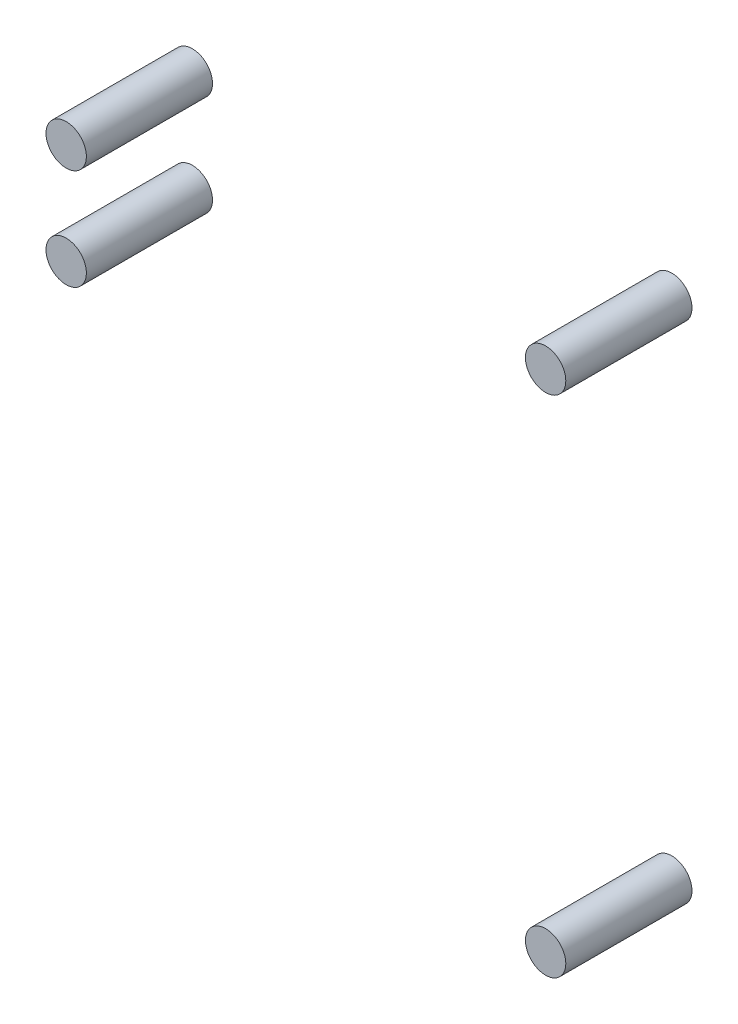
ISO-10303-21;
HEADER;
FILE_DESCRIPTION(('STEP AP214'),'2;1');
FILE_NAME('part.step','',(''),(''),'','','');
FILE_SCHEMA(('AUTOMOTIVE_DESIGN { 1 0 10303 214 1 1 1 1 }'));
ENDSEC;
DATA;
#1=APPLICATION_CONTEXT('core data for automotive mechanical design processes');
#2=APPLICATION_PROTOCOL_DEFINITION('international standard','automotive_design',2000,#1);
#3=PRODUCT_CONTEXT('',#1,'mechanical');
#4=PRODUCT('Part','Part','',(#3));
#5=PRODUCT_RELATED_PRODUCT_CATEGORY('part','',(#4));
#6=PRODUCT_DEFINITION_FORMATION('','',#4);
#7=PRODUCT_DEFINITION_CONTEXT('part definition',#1,'design');
#8=PRODUCT_DEFINITION('design','',#6,#7);
#9=PRODUCT_DEFINITION_SHAPE('','',#8);
#10=(LENGTH_UNIT() NAMED_UNIT(*) SI_UNIT(.MILLI.,.METRE.));
#11=(NAMED_UNIT(*) PLANE_ANGLE_UNIT() SI_UNIT($,.RADIAN.));
#12=(NAMED_UNIT(*) SI_UNIT($,.STERADIAN.) SOLID_ANGLE_UNIT());
#13=UNCERTAINTY_MEASURE_WITH_UNIT(LENGTH_MEASURE(1.E-05),#10,'distance_accuracy_value','');
#14=(GEOMETRIC_REPRESENTATION_CONTEXT(3) GLOBAL_UNCERTAINTY_ASSIGNED_CONTEXT((#13)) GLOBAL_UNIT_ASSIGNED_CONTEXT((#10,
#11,#12)) REPRESENTATION_CONTEXT('',''));
#15=CARTESIAN_POINT('',(0.,0.,0.));
#16=DIRECTION('',(0.,0.,1.));
#17=DIRECTION('',(1.,0.,0.));
#18=AXIS2_PLACEMENT_3D('',#15,#16,#17);
#19=CARTESIAN_POINT('',(74.5,-27.,5.));
#20=DIRECTION('',(0.,0.,-1.));
#21=DIRECTION('',(-1.,0.,0.));
#22=AXIS2_PLACEMENT_3D('',#19,#20,#21);
#23=CYLINDRICAL_SURFACE('',#22,2.);
#24=CARTESIAN_POINT('',(74.5,-27.,5.));
#25=DIRECTION('',(0.,0.,1.));
#26=DIRECTION('',(1.,0.,0.));
#27=AXIS2_PLACEMENT_3D('',#24,#25,#26);
#28=CIRCLE('',#27,2.);
#29=CARTESIAN_POINT('',(76.5,-27.,5.));
#30=VERTEX_POINT('',#29);
#31=EDGE_CURVE('E51',#30,#30,#28,.T.);
#32=ORIENTED_EDGE('',*,*,#31,.F.);
#33=EDGE_LOOP('',(#32));
#34=FACE_BOUND('',#33,.T.);
#35=CARTESIAN_POINT('',(74.5,-27.,-7.5));
#36=DIRECTION('',(0.,0.,1.));
#37=DIRECTION('',(1.,0.,0.));
#38=AXIS2_PLACEMENT_3D('',#35,#36,#37);
#39=CIRCLE('',#38,2.);
#40=CARTESIAN_POINT('',(76.5,-27.,-7.5));
#41=VERTEX_POINT('',#40);
#42=EDGE_CURVE('E11',#41,#41,#39,.T.);
#43=ORIENTED_EDGE('',*,*,#42,.T.);
#44=EDGE_LOOP('',(#43));
#45=FACE_BOUND('',#44,.T.);
#46=ADVANCED_FACE('F44',(#34,#45),#23,.T.);
#47=CARTESIAN_POINT('',(74.5,-27.,5.));
#48=DIRECTION('',(0.,0.,1.));
#49=DIRECTION('',(1.,0.,0.));
#50=AXIS2_PLACEMENT_3D('',#47,#48,#49);
#51=PLANE('',#50);
#52=ORIENTED_EDGE('',*,*,#31,.T.);
#53=EDGE_LOOP('',(#52));
#54=FACE_BOUND('',#53,.T.);
#55=ADVANCED_FACE('F57',(#54),#51,.T.);
#56=CARTESIAN_POINT('',(74.5,-27.,-7.5));
#57=DIRECTION('',(0.,0.,1.));
#58=DIRECTION('',(1.,0.,0.));
#59=AXIS2_PLACEMENT_3D('',#56,#57,#58);
#60=PLANE('',#59);
#61=ORIENTED_EDGE('',*,*,#42,.F.);
#62=EDGE_LOOP('',(#61));
#63=FACE_BOUND('',#62,.T.);
#64=ADVANCED_FACE('F46',(#63),#60,.F.);
#65=CLOSED_SHELL('',(#46,#55,#64));
#66=MANIFOLD_SOLID_BREP('B2',#65);
#67=CARTESIAN_POINT('',(74.5,23.,5.));
#68=DIRECTION('',(0.,0.,-1.));
#69=DIRECTION('',(-1.,0.,0.));
#70=AXIS2_PLACEMENT_3D('',#67,#68,#69);
#71=CYLINDRICAL_SURFACE('',#70,2.);
#72=CARTESIAN_POINT('',(74.5,23.,5.));
#73=DIRECTION('',(0.,0.,1.));
#74=DIRECTION('',(1.,0.,0.));
#75=AXIS2_PLACEMENT_3D('',#72,#73,#74);
#76=CIRCLE('',#75,2.);
#77=CARTESIAN_POINT('',(76.5,23.,5.));
#78=VERTEX_POINT('',#77);
#79=EDGE_CURVE('E106',#78,#78,#76,.T.);
#80=ORIENTED_EDGE('',*,*,#79,.F.);
#81=EDGE_LOOP('',(#80));
#82=FACE_BOUND('',#81,.T.);
#83=CARTESIAN_POINT('',(74.5,23.,-7.5));
#84=DIRECTION('',(0.,0.,1.));
#85=DIRECTION('',(1.,0.,0.));
#86=AXIS2_PLACEMENT_3D('',#83,#84,#85);
#87=CIRCLE('',#86,2.);
#88=CARTESIAN_POINT('',(76.5,23.,-7.5));
#89=VERTEX_POINT('',#88);
#90=EDGE_CURVE('E43',#89,#89,#87,.T.);
#91=ORIENTED_EDGE('',*,*,#90,.T.);
#92=EDGE_LOOP('',(#91));
#93=FACE_BOUND('',#92,.T.);
#94=ADVANCED_FACE('F99',(#82,#93),#71,.T.);
#95=CARTESIAN_POINT('',(74.5,23.,5.));
#96=DIRECTION('',(0.,0.,1.));
#97=DIRECTION('',(1.,0.,0.));
#98=AXIS2_PLACEMENT_3D('',#95,#96,#97);
#99=PLANE('',#98);
#100=ORIENTED_EDGE('',*,*,#79,.T.);
#101=EDGE_LOOP('',(#100));
#102=FACE_BOUND('',#101,.T.);
#103=ADVANCED_FACE('F112',(#102),#99,.T.);
#104=CARTESIAN_POINT('',(74.5,23.,-7.5));
#105=DIRECTION('',(0.,0.,1.));
#106=DIRECTION('',(1.,0.,0.));
#107=AXIS2_PLACEMENT_3D('',#104,#105,#106);
#108=PLANE('',#107);
#109=ORIENTED_EDGE('',*,*,#90,.F.);
#110=EDGE_LOOP('',(#109));
#111=FACE_BOUND('',#110,.T.);
#112=ADVANCED_FACE('F101',(#111),#108,.F.);
#113=CLOSED_SHELL('',(#94,#103,#112));
#114=MANIFOLD_SOLID_BREP('B6',#113);
#115=CARTESIAN_POINT('',(27.,18.5,5.));
#116=DIRECTION('',(0.,0.,-1.));
#117=DIRECTION('',(-1.,0.,0.));
#118=AXIS2_PLACEMENT_3D('',#115,#116,#117);
#119=CYLINDRICAL_SURFACE('',#118,2.00000000000001);
#120=CARTESIAN_POINT('',(27.,18.5,5.));
#121=DIRECTION('',(0.,0.,1.));
#122=DIRECTION('',(1.,0.,0.));
#123=AXIS2_PLACEMENT_3D('',#120,#121,#122);
#124=CIRCLE('',#123,2.00000000000001);
#125=CARTESIAN_POINT('',(29.,18.5,5.));
#126=VERTEX_POINT('',#125);
#127=EDGE_CURVE('E160',#126,#126,#124,.T.);
#128=ORIENTED_EDGE('',*,*,#127,.F.);
#129=EDGE_LOOP('',(#128));
#130=FACE_BOUND('',#129,.T.);
#131=CARTESIAN_POINT('',(27.,18.5,-7.5));
#132=DIRECTION('',(0.,0.,1.));
#133=DIRECTION('',(1.,0.,0.));
#134=AXIS2_PLACEMENT_3D('',#131,#132,#133);
#135=CIRCLE('',#134,2.00000000000001);
#136=CARTESIAN_POINT('',(29.,18.5,-7.5));
#137=VERTEX_POINT('',#136);
#138=EDGE_CURVE('E98',#137,#137,#135,.T.);
#139=ORIENTED_EDGE('',*,*,#138,.T.);
#140=EDGE_LOOP('',(#139));
#141=FACE_BOUND('',#140,.T.);
#142=ADVANCED_FACE('F153',(#130,#141),#119,.T.);
#143=CARTESIAN_POINT('',(27.,18.5,5.));
#144=DIRECTION('',(0.,0.,1.));
#145=DIRECTION('',(1.,0.,0.));
#146=AXIS2_PLACEMENT_3D('',#143,#144,#145);
#147=PLANE('',#146);
#148=ORIENTED_EDGE('',*,*,#127,.T.);
#149=EDGE_LOOP('',(#148));
#150=FACE_BOUND('',#149,.T.);
#151=ADVANCED_FACE('F166',(#150),#147,.T.);
#152=CARTESIAN_POINT('',(27.,18.5,-7.5));
#153=DIRECTION('',(0.,0.,1.));
#154=DIRECTION('',(1.,0.,0.));
#155=AXIS2_PLACEMENT_3D('',#152,#153,#154);
#156=PLANE('',#155);
#157=ORIENTED_EDGE('',*,*,#138,.F.);
#158=EDGE_LOOP('',(#157));
#159=FACE_BOUND('',#158,.T.);
#160=ADVANCED_FACE('F155',(#159),#156,.F.);
#161=CLOSED_SHELL('',(#142,#151,#160));
#162=MANIFOLD_SOLID_BREP('B38',#161);
#163=CARTESIAN_POINT('',(27.,8.50000000000001,5.));
#164=DIRECTION('',(0.,0.,-1.));
#165=DIRECTION('',(-1.,0.,0.));
#166=AXIS2_PLACEMENT_3D('',#163,#164,#165);
#167=CYLINDRICAL_SURFACE('',#166,2.);
#168=CARTESIAN_POINT('',(27.,8.50000000000001,5.));
#169=DIRECTION('',(0.,0.,1.));
#170=DIRECTION('',(1.,0.,0.));
#171=AXIS2_PLACEMENT_3D('',#168,#169,#170);
#172=CIRCLE('',#171,2.);
#173=CARTESIAN_POINT('',(29.,8.50000000000001,5.));
#174=VERTEX_POINT('',#173);
#175=EDGE_CURVE('E152',#174,#174,#172,.T.);
#176=ORIENTED_EDGE('',*,*,#175,.F.);
#177=EDGE_LOOP('',(#176));
#178=FACE_BOUND('',#177,.T.);
#179=CARTESIAN_POINT('',(27.,8.50000000000001,-7.5));
#180=DIRECTION('',(0.,0.,1.));
#181=DIRECTION('',(1.,0.,0.));
#182=AXIS2_PLACEMENT_3D('',#179,#180,#181);
#183=CIRCLE('',#182,2.);
#184=CARTESIAN_POINT('',(29.,8.50000000000001,-7.5));
#185=VERTEX_POINT('',#184);
#186=EDGE_CURVE('E206',#185,#185,#183,.T.);
#187=ORIENTED_EDGE('',*,*,#186,.T.);
#188=EDGE_LOOP('',(#187));
#189=FACE_BOUND('',#188,.T.);
#190=ADVANCED_FACE('F200',(#178,#189),#167,.T.);
#191=CARTESIAN_POINT('',(27.,8.50000000000001,5.));
#192=DIRECTION('',(0.,0.,1.));
#193=DIRECTION('',(1.,0.,0.));
#194=AXIS2_PLACEMENT_3D('',#191,#192,#193);
#195=PLANE('',#194);
#196=ORIENTED_EDGE('',*,*,#175,.T.);
#197=EDGE_LOOP('',(#196));
#198=FACE_BOUND('',#197,.T.);
#199=ADVANCED_FACE('F215',(#198),#195,.T.);
#200=CARTESIAN_POINT('',(27.,8.50000000000001,-7.5));
#201=DIRECTION('',(0.,0.,1.));
#202=DIRECTION('',(1.,0.,0.));
#203=AXIS2_PLACEMENT_3D('',#200,#201,#202);
#204=PLANE('',#203);
#205=ORIENTED_EDGE('',*,*,#186,.F.);
#206=EDGE_LOOP('',(#205));
#207=FACE_BOUND('',#206,.T.);
#208=ADVANCED_FACE('F213',(#207),#204,.F.);
#209=CLOSED_SHELL('',(#190,#199,#208));
#210=MANIFOLD_SOLID_BREP('B93',#209);
#211=ADVANCED_BREP_SHAPE_REPRESENTATION('',(#18,#66,#114,#162,#210),#14);
#212=SHAPE_DEFINITION_REPRESENTATION(#9,#211);
ENDSEC;
END-ISO-10303-21;
